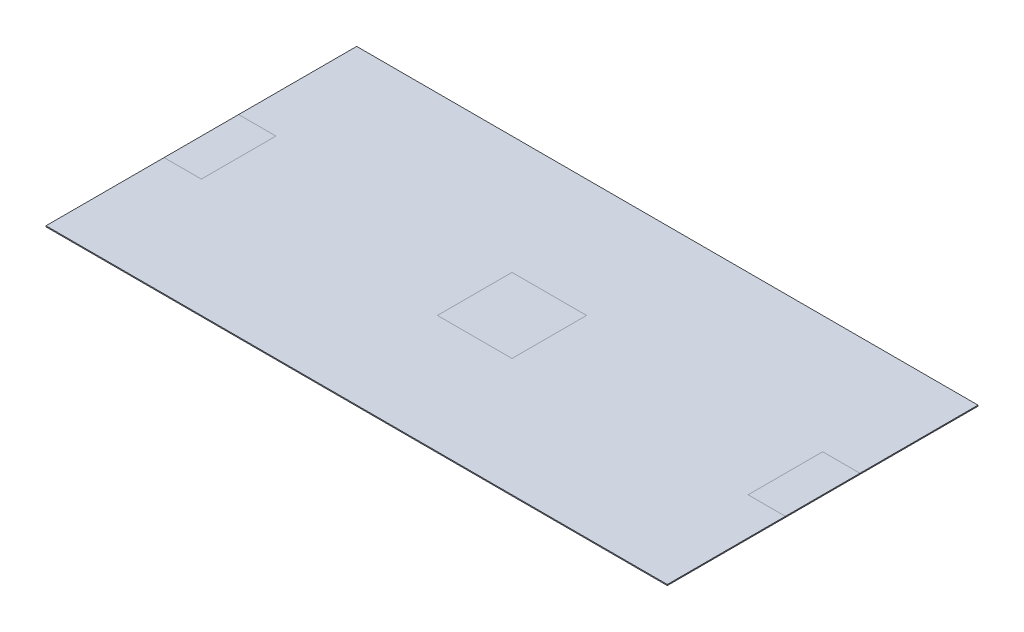
ISO-10303-21;
HEADER;
FILE_DESCRIPTION(('STEP AP214'),'2;1');
FILE_NAME('part.step','',(''),(''),'','','');
FILE_SCHEMA(('AUTOMOTIVE_DESIGN { 1 0 10303 214 1 1 1 1 }'));
ENDSEC;
DATA;
#1=APPLICATION_CONTEXT('core data for automotive mechanical design processes');
#2=APPLICATION_PROTOCOL_DEFINITION('international standard','automotive_design',2000,#1);
#3=PRODUCT_CONTEXT('',#1,'mechanical');
#4=PRODUCT('Part','Part','',(#3));
#5=PRODUCT_RELATED_PRODUCT_CATEGORY('part','',(#4));
#6=PRODUCT_DEFINITION_FORMATION('','',#4);
#7=PRODUCT_DEFINITION_CONTEXT('part definition',#1,'design');
#8=PRODUCT_DEFINITION('design','',#6,#7);
#9=PRODUCT_DEFINITION_SHAPE('','',#8);
#10=(LENGTH_UNIT() NAMED_UNIT(*) SI_UNIT(.MILLI.,.METRE.));
#11=(NAMED_UNIT(*) PLANE_ANGLE_UNIT() SI_UNIT($,.RADIAN.));
#12=(NAMED_UNIT(*) SI_UNIT($,.STERADIAN.) SOLID_ANGLE_UNIT());
#13=UNCERTAINTY_MEASURE_WITH_UNIT(LENGTH_MEASURE(1.E-05),#10,'distance_accuracy_value','');
#14=(GEOMETRIC_REPRESENTATION_CONTEXT(3) GLOBAL_UNCERTAINTY_ASSIGNED_CONTEXT((#13)) GLOBAL_UNIT_ASSIGNED_CONTEXT((#10,
#11,#12)) REPRESENTATION_CONTEXT('',''));
#15=CARTESIAN_POINT('',(0.,0.,0.));
#16=DIRECTION('',(0.,0.,1.));
#17=DIRECTION('',(1.,0.,0.));
#18=AXIS2_PLACEMENT_3D('',#15,#16,#17);
#19=CARTESIAN_POINT('',(-150.,-0.00999999999999959,150.));
#20=DIRECTION('',(0.,0.,1.));
#21=DIRECTION('',(1.,0.,0.));
#22=AXIS2_PLACEMENT_3D('',#19,#20,#21);
#23=PLANE('',#22);
#24=DIRECTION('',(-1.,0.,0.));
#25=VECTOR('',#24,1.);
#26=CARTESIAN_POINT('',(0.,0.,150.));
#27=LINE('',#26,#25);
#28=CARTESIAN_POINT('',(150.,0.,150.));
#29=VERTEX_POINT('',#28);
#30=CARTESIAN_POINT('',(-150.,0.,150.));
#31=VERTEX_POINT('',#30);
#32=EDGE_CURVE('E96',#29,#31,#27,.T.);
#33=ORIENTED_EDGE('',*,*,#32,.F.);
#34=DIRECTION('',(0.,1.,0.));
#35=VECTOR('',#34,1.);
#36=CARTESIAN_POINT('',(150.,-0.00999999999999959,150.));
#37=LINE('',#36,#35);
#38=CARTESIAN_POINT('',(150.,4.,150.));
#39=VERTEX_POINT('',#38);
#40=EDGE_CURVE('E56',#29,#39,#37,.T.);
#41=ORIENTED_EDGE('',*,*,#40,.T.);
#42=DIRECTION('',(-1.,0.,0.));
#43=VECTOR('',#42,1.);
#44=CARTESIAN_POINT('',(0.,4.,150.));
#45=LINE('',#44,#43);
#46=CARTESIAN_POINT('',(-150.,4.,150.));
#47=VERTEX_POINT('',#46);
#48=EDGE_CURVE('E51',#39,#47,#45,.T.);
#49=ORIENTED_EDGE('',*,*,#48,.T.);
#50=DIRECTION('',(0.,1.,0.));
#51=VECTOR('',#50,1.);
#52=CARTESIAN_POINT('',(-150.,-0.00999999999999959,150.));
#53=LINE('',#52,#51);
#54=EDGE_CURVE('E12',#31,#47,#53,.T.);
#55=ORIENTED_EDGE('',*,*,#54,.F.);
#56=EDGE_LOOP('',(#33,#41,#49,#55));
#57=FACE_BOUND('',#56,.T.);
#58=ADVANCED_FACE('F47',(#57),#23,.T.);
#59=CARTESIAN_POINT('',(150.,-0.00999999999999959,150.));
#60=DIRECTION('',(1.,0.,0.));
#61=DIRECTION('',(0.,0.,-1.));
#62=AXIS2_PLACEMENT_3D('',#59,#60,#61);
#63=PLANE('',#62);
#64=DIRECTION('',(0.,0.,1.));
#65=VECTOR('',#64,1.);
#66=CARTESIAN_POINT('',(150.,0.,0.));
#67=LINE('',#66,#65);
#68=CARTESIAN_POINT('',(150.,0.,-150.));
#69=VERTEX_POINT('',#68);
#70=EDGE_CURVE('E91',#69,#29,#67,.T.);
#71=ORIENTED_EDGE('',*,*,#70,.F.);
#72=DIRECTION('',(0.,1.,0.));
#73=VECTOR('',#72,1.);
#74=CARTESIAN_POINT('',(150.,-0.00999999999999959,-150.));
#75=LINE('',#74,#73);
#76=CARTESIAN_POINT('',(150.,4.,-150.));
#77=VERTEX_POINT('',#76);
#78=EDGE_CURVE('E85',#69,#77,#75,.T.);
#79=ORIENTED_EDGE('',*,*,#78,.T.);
#80=DIRECTION('',(0.,0.,1.));
#81=VECTOR('',#80,1.);
#82=CARTESIAN_POINT('',(150.,4.,0.));
#83=LINE('',#82,#81);
#84=EDGE_CURVE('E89',#77,#39,#83,.T.);
#85=ORIENTED_EDGE('',*,*,#84,.T.);
#86=ORIENTED_EDGE('',*,*,#40,.F.);
#87=EDGE_LOOP('',(#71,#79,#85,#86));
#88=FACE_BOUND('',#87,.T.);
#89=ADVANCED_FACE('F87',(#88),#63,.T.);
#90=CARTESIAN_POINT('',(-150.,-0.00999999999999959,150.));
#91=DIRECTION('',(-1.,0.,0.));
#92=DIRECTION('',(0.,0.,1.));
#93=AXIS2_PLACEMENT_3D('',#90,#91,#92);
#94=PLANE('',#93);
#95=DIRECTION('',(0.,0.,-1.));
#96=VECTOR('',#95,1.);
#97=CARTESIAN_POINT('',(-150.,0.,0.));
#98=LINE('',#97,#96);
#99=CARTESIAN_POINT('',(-150.,0.,-150.));
#100=VERTEX_POINT('',#99);
#101=EDGE_CURVE('E116',#31,#100,#98,.T.);
#102=ORIENTED_EDGE('',*,*,#101,.F.);
#103=ORIENTED_EDGE('',*,*,#54,.T.);
#104=DIRECTION('',(0.,0.,-1.));
#105=VECTOR('',#104,1.);
#106=CARTESIAN_POINT('',(-150.,4.,0.));
#107=LINE('',#106,#105);
#108=CARTESIAN_POINT('',(-150.,4.,-150.));
#109=VERTEX_POINT('',#108);
#110=EDGE_CURVE('E104',#47,#109,#107,.T.);
#111=ORIENTED_EDGE('',*,*,#110,.T.);
#112=DIRECTION('',(0.,1.,0.));
#113=VECTOR('',#112,1.);
#114=CARTESIAN_POINT('',(-150.,-0.00999999999999959,-150.));
#115=LINE('',#114,#113);
#116=EDGE_CURVE('E95',#100,#109,#115,.T.);
#117=ORIENTED_EDGE('',*,*,#116,.F.);
#118=EDGE_LOOP('',(#102,#103,#111,#117));
#119=FACE_BOUND('',#118,.T.);
#120=ADVANCED_FACE('F121',(#119),#94,.T.);
#121=CARTESIAN_POINT('',(-150.,-0.00999999999999959,-150.));
#122=DIRECTION('',(0.,0.,-1.));
#123=DIRECTION('',(-1.,0.,0.));
#124=AXIS2_PLACEMENT_3D('',#121,#122,#123);
#125=PLANE('',#124);
#126=DIRECTION('',(1.,0.,0.));
#127=VECTOR('',#126,1.);
#128=CARTESIAN_POINT('',(0.,0.,-150.));
#129=LINE('',#128,#127);
#130=EDGE_CURVE('E108',#100,#69,#129,.T.);
#131=ORIENTED_EDGE('',*,*,#130,.F.);
#132=ORIENTED_EDGE('',*,*,#116,.T.);
#133=DIRECTION('',(1.,0.,0.));
#134=VECTOR('',#133,1.);
#135=CARTESIAN_POINT('',(0.,4.,-150.));
#136=LINE('',#135,#134);
#137=EDGE_CURVE('E99',#109,#77,#136,.T.);
#138=ORIENTED_EDGE('',*,*,#137,.T.);
#139=ORIENTED_EDGE('',*,*,#78,.F.);
#140=EDGE_LOOP('',(#131,#132,#138,#139));
#141=FACE_BOUND('',#140,.T.);
#142=ADVANCED_FACE('F100',(#141),#125,.T.);
#143=CARTESIAN_POINT('',(0.,0.,0.));
#144=DIRECTION('',(0.,-1.,0.));
#145=DIRECTION('',(0.,0.,-1.));
#146=AXIS2_PLACEMENT_3D('',#143,#144,#145);
#147=PLANE('',#146);
#148=ORIENTED_EDGE('',*,*,#130,.T.);
#149=ORIENTED_EDGE('',*,*,#70,.T.);
#150=ORIENTED_EDGE('',*,*,#32,.T.);
#151=ORIENTED_EDGE('',*,*,#101,.T.);
#152=EDGE_LOOP('',(#148,#149,#150,#151));
#153=FACE_BOUND('',#152,.T.);
#154=ADVANCED_FACE('F119',(#153),#147,.T.);
#155=CARTESIAN_POINT('',(0.,4.,0.));
#156=DIRECTION('',(0.,-1.,0.));
#157=DIRECTION('',(0.,0.,-1.));
#158=AXIS2_PLACEMENT_3D('',#155,#156,#157);
#159=PLANE('',#158);
#160=ORIENTED_EDGE('',*,*,#84,.F.);
#161=ORIENTED_EDGE('',*,*,#137,.F.);
#162=ORIENTED_EDGE('',*,*,#110,.F.);
#163=ORIENTED_EDGE('',*,*,#48,.F.);
#164=EDGE_LOOP('',(#160,#161,#162,#163));
#165=FACE_BOUND('',#164,.T.);
#166=ADVANCED_FACE('F49',(#165),#159,.F.);
#167=CLOSED_SHELL('',(#58,#89,#120,#142,#154,#166));
#168=MANIFOLD_SOLID_BREP('B2',#167);
#169=CARTESIAN_POINT('',(-1100.,-0.00999999999999959,-150.));
#170=DIRECTION('',(0.,0.,-1.));
#171=DIRECTION('',(-1.,0.,0.));
#172=AXIS2_PLACEMENT_3D('',#169,#170,#171);
#173=PLANE('',#172);
#174=DIRECTION('',(1.,0.,0.));
#175=VECTOR('',#174,1.);
#176=CARTESIAN_POINT('',(0.,0.,-150.));
#177=LINE('',#176,#175);
#178=CARTESIAN_POINT('',(-1250.,0.,-150.));
#179=VERTEX_POINT('',#178);
#180=CARTESIAN_POINT('',(-1100.,0.,-150.));
#181=VERTEX_POINT('',#180);
#182=EDGE_CURVE('E232',#179,#181,#177,.T.);
#183=ORIENTED_EDGE('',*,*,#182,.F.);
#184=DIRECTION('',(0.,1.,0.));
#185=VECTOR('',#184,1.);
#186=CARTESIAN_POINT('',(-1250.,-0.00999999999999959,-150.));
#187=LINE('',#186,#185);
#188=CARTESIAN_POINT('',(-1250.,4.,-150.));
#189=VERTEX_POINT('',#188);
#190=EDGE_CURVE('E224',#179,#189,#187,.T.);
#191=ORIENTED_EDGE('',*,*,#190,.T.);
#192=DIRECTION('',(1.,0.,0.));
#193=VECTOR('',#192,1.);
#194=CARTESIAN_POINT('',(0.,4.,-150.));
#195=LINE('',#194,#193);
#196=CARTESIAN_POINT('',(-1100.,4.,-150.));
#197=VERTEX_POINT('',#196);
#198=EDGE_CURVE('E235',#189,#197,#195,.T.);
#199=ORIENTED_EDGE('',*,*,#198,.T.);
#200=DIRECTION('',(0.,1.,0.));
#201=VECTOR('',#200,1.);
#202=CARTESIAN_POINT('',(-1100.,-0.00999999999999959,-150.));
#203=LINE('',#202,#201);
#204=EDGE_CURVE('E45',#181,#197,#203,.T.);
#205=ORIENTED_EDGE('',*,*,#204,.F.);
#206=EDGE_LOOP('',(#183,#191,#199,#205));
#207=FACE_BOUND('',#206,.T.);
#208=ADVANCED_FACE('F181',(#207),#173,.T.);
#209=CARTESIAN_POINT('',(-1100.,-0.00999999999999959,150.));
#210=DIRECTION('',(1.,0.,0.));
#211=DIRECTION('',(0.,0.,-1.));
#212=AXIS2_PLACEMENT_3D('',#209,#210,#211);
#213=PLANE('',#212);
#214=DIRECTION('',(0.,0.,1.));
#215=VECTOR('',#214,1.);
#216=CARTESIAN_POINT('',(-1100.,0.,0.));
#217=LINE('',#216,#215);
#218=CARTESIAN_POINT('',(-1100.,0.,150.));
#219=VERTEX_POINT('',#218);
#220=EDGE_CURVE('E250',#181,#219,#217,.T.);
#221=ORIENTED_EDGE('',*,*,#220,.F.);
#222=ORIENTED_EDGE('',*,*,#204,.T.);
#223=DIRECTION('',(0.,0.,1.));
#224=VECTOR('',#223,1.);
#225=CARTESIAN_POINT('',(-1100.,4.,0.));
#226=LINE('',#225,#224);
#227=CARTESIAN_POINT('',(-1100.,4.,150.));
#228=VERTEX_POINT('',#227);
#229=EDGE_CURVE('E241',#197,#228,#226,.T.);
#230=ORIENTED_EDGE('',*,*,#229,.T.);
#231=DIRECTION('',(0.,1.,0.));
#232=VECTOR('',#231,1.);
#233=CARTESIAN_POINT('',(-1100.,-0.00999999999999959,150.));
#234=LINE('',#233,#232);
#235=EDGE_CURVE('E189',#219,#228,#234,.T.);
#236=ORIENTED_EDGE('',*,*,#235,.F.);
#237=EDGE_LOOP('',(#221,#222,#230,#236));
#238=FACE_BOUND('',#237,.T.);
#239=ADVANCED_FACE('F256',(#238),#213,.T.);
#240=CARTESIAN_POINT('',(-1250.,-0.00999999999999959,150.));
#241=DIRECTION('',(0.,0.,1.));
#242=DIRECTION('',(1.,0.,0.));
#243=AXIS2_PLACEMENT_3D('',#240,#241,#242);
#244=PLANE('',#243);
#245=DIRECTION('',(-1.,0.,0.));
#246=VECTOR('',#245,1.);
#247=CARTESIAN_POINT('',(0.,0.,150.));
#248=LINE('',#247,#246);
#249=CARTESIAN_POINT('',(-1250.,0.,150.));
#250=VERTEX_POINT('',#249);
#251=EDGE_CURVE('E248',#219,#250,#248,.T.);
#252=ORIENTED_EDGE('',*,*,#251,.F.);
#253=ORIENTED_EDGE('',*,*,#235,.T.);
#254=DIRECTION('',(-1.,0.,0.));
#255=VECTOR('',#254,1.);
#256=CARTESIAN_POINT('',(0.,4.,150.));
#257=LINE('',#256,#255);
#258=CARTESIAN_POINT('',(-1250.,4.,150.));
#259=VERTEX_POINT('',#258);
#260=EDGE_CURVE('E238',#228,#259,#257,.T.);
#261=ORIENTED_EDGE('',*,*,#260,.T.);
#262=DIRECTION('',(0.,1.,0.));
#263=VECTOR('',#262,1.);
#264=CARTESIAN_POINT('',(-1250.,-0.00999999999999959,150.));
#265=LINE('',#264,#263);
#266=EDGE_CURVE('E227',#250,#259,#265,.T.);
#267=ORIENTED_EDGE('',*,*,#266,.F.);
#268=EDGE_LOOP('',(#252,#253,#261,#267));
#269=FACE_BOUND('',#268,.T.);
#270=ADVANCED_FACE('F254',(#269),#244,.T.);
#271=CARTESIAN_POINT('',(-1250.,4.,625.));
#272=DIRECTION('',(1.,0.,0.));
#273=DIRECTION('',(0.,0.,-1.));
#274=AXIS2_PLACEMENT_3D('',#271,#272,#273);
#275=PLANE('',#274);
#276=DIRECTION('',(0.,0.,1.));
#277=VECTOR('',#276,1.);
#278=CARTESIAN_POINT('',(-1250.,0.,625.));
#279=LINE('',#278,#277);
#280=EDGE_CURVE('E231',#179,#250,#279,.T.);
#281=ORIENTED_EDGE('',*,*,#280,.T.);
#282=ORIENTED_EDGE('',*,*,#266,.T.);
#283=DIRECTION('',(0.,0.,1.));
#284=VECTOR('',#283,1.);
#285=CARTESIAN_POINT('',(-1250.,4.,625.));
#286=LINE('',#285,#284);
#287=EDGE_CURVE('E220',#189,#259,#286,.T.);
#288=ORIENTED_EDGE('',*,*,#287,.F.);
#289=ORIENTED_EDGE('',*,*,#190,.F.);
#290=EDGE_LOOP('',(#281,#282,#288,#289));
#291=FACE_BOUND('',#290,.T.);
#292=ADVANCED_FACE('F223',(#291),#275,.F.);
#293=CARTESIAN_POINT('',(0.,4.,0.));
#294=DIRECTION('',(0.,-1.,0.));
#295=DIRECTION('',(0.,0.,-1.));
#296=AXIS2_PLACEMENT_3D('',#293,#294,#295);
#297=PLANE('',#296);
#298=ORIENTED_EDGE('',*,*,#260,.F.);
#299=ORIENTED_EDGE('',*,*,#229,.F.);
#300=ORIENTED_EDGE('',*,*,#198,.F.);
#301=ORIENTED_EDGE('',*,*,#287,.T.);
#302=EDGE_LOOP('',(#298,#299,#300,#301));
#303=FACE_BOUND('',#302,.T.);
#304=ADVANCED_FACE('F240',(#303),#297,.F.);
#305=CARTESIAN_POINT('',(0.,0.,0.));
#306=DIRECTION('',(0.,-1.,0.));
#307=DIRECTION('',(0.,0.,-1.));
#308=AXIS2_PLACEMENT_3D('',#305,#306,#307);
#309=PLANE('',#308);
#310=ORIENTED_EDGE('',*,*,#220,.T.);
#311=ORIENTED_EDGE('',*,*,#251,.T.);
#312=ORIENTED_EDGE('',*,*,#280,.F.);
#313=ORIENTED_EDGE('',*,*,#182,.T.);
#314=EDGE_LOOP('',(#310,#311,#312,#313));
#315=FACE_BOUND('',#314,.T.);
#316=ADVANCED_FACE('F183',(#315),#309,.T.);
#317=CLOSED_SHELL('',(#208,#239,#270,#292,#304,#316));
#318=MANIFOLD_SOLID_BREP('B6',#317);
#319=CARTESIAN_POINT('',(-1100.,-0.00999999999999959,-150.));
#320=DIRECTION('',(0.,0.,-1.));
#321=DIRECTION('',(-1.,0.,0.));
#322=AXIS2_PLACEMENT_3D('',#319,#320,#321);
#323=PLANE('',#322);
#324=DIRECTION('',(1.,0.,0.));
#325=VECTOR('',#324,1.);
#326=CARTESIAN_POINT('',(0.,0.,-150.));
#327=LINE('',#326,#325);
#328=CARTESIAN_POINT('',(-1250.,0.,-150.));
#329=VERTEX_POINT('',#328);
#330=CARTESIAN_POINT('',(-1100.,0.,-150.));
#331=VERTEX_POINT('',#330);
#332=EDGE_CURVE('E474',#329,#331,#327,.T.);
#333=ORIENTED_EDGE('',*,*,#332,.T.);
#334=DIRECTION('',(0.,1.,0.));
#335=VECTOR('',#334,1.);
#336=CARTESIAN_POINT('',(-1100.,-0.00999999999999959,-150.));
#337=LINE('',#336,#335);
#338=CARTESIAN_POINT('',(-1100.,4.,-150.));
#339=VERTEX_POINT('',#338);
#340=EDGE_CURVE('E318',#331,#339,#337,.T.);
#341=ORIENTED_EDGE('',*,*,#340,.T.);
#342=DIRECTION('',(1.,0.,0.));
#343=VECTOR('',#342,1.);
#344=CARTESIAN_POINT('',(0.,4.,-150.));
#345=LINE('',#344,#343);
#346=CARTESIAN_POINT('',(-1250.,4.,-150.));
#347=VERTEX_POINT('',#346);
#348=EDGE_CURVE('E461',#347,#339,#345,.T.);
#349=ORIENTED_EDGE('',*,*,#348,.F.);
#350=DIRECTION('',(0.,1.,0.));
#351=VECTOR('',#350,1.);
#352=CARTESIAN_POINT('',(-1250.,-0.00999999999999959,-150.));
#353=LINE('',#352,#351);
#354=EDGE_CURVE('E470',#329,#347,#353,.T.);
#355=ORIENTED_EDGE('',*,*,#354,.F.);
#356=EDGE_LOOP('',(#333,#341,#349,#355));
#357=FACE_BOUND('',#356,.T.);
#358=ADVANCED_FACE('F314',(#357),#323,.F.);
#359=CARTESIAN_POINT('',(-1100.,-0.00999999999999959,150.));
#360=DIRECTION('',(1.,0.,0.));
#361=DIRECTION('',(0.,0.,-1.));
#362=AXIS2_PLACEMENT_3D('',#359,#360,#361);
#363=PLANE('',#362);
#364=DIRECTION('',(0.,0.,1.));
#365=VECTOR('',#364,1.);
#366=CARTESIAN_POINT('',(-1100.,0.,0.));
#367=LINE('',#366,#365);
#368=CARTESIAN_POINT('',(-1100.,0.,150.));
#369=VERTEX_POINT('',#368);
#370=EDGE_CURVE('E489',#331,#369,#367,.T.);
#371=ORIENTED_EDGE('',*,*,#370,.T.);
#372=DIRECTION('',(0.,1.,0.));
#373=VECTOR('',#372,1.);
#374=CARTESIAN_POINT('',(-1100.,-0.00999999999999959,150.));
#375=LINE('',#374,#373);
#376=CARTESIAN_POINT('',(-1100.,4.,150.));
#377=VERTEX_POINT('',#376);
#378=EDGE_CURVE('E478',#369,#377,#375,.T.);
#379=ORIENTED_EDGE('',*,*,#378,.T.);
#380=DIRECTION('',(0.,0.,1.));
#381=VECTOR('',#380,1.);
#382=CARTESIAN_POINT('',(-1100.,4.,0.));
#383=LINE('',#382,#381);
#384=EDGE_CURVE('E502',#339,#377,#383,.T.);
#385=ORIENTED_EDGE('',*,*,#384,.F.);
#386=ORIENTED_EDGE('',*,*,#340,.F.);
#387=EDGE_LOOP('',(#371,#379,#385,#386));
#388=FACE_BOUND('',#387,.T.);
#389=ADVANCED_FACE('F503',(#388),#363,.F.);
#390=CARTESIAN_POINT('',(-1250.,-0.00999999999999959,150.));
#391=DIRECTION('',(0.,0.,1.));
#392=DIRECTION('',(1.,0.,0.));
#393=AXIS2_PLACEMENT_3D('',#390,#391,#392);
#394=PLANE('',#393);
#395=DIRECTION('',(-1.,0.,0.));
#396=VECTOR('',#395,1.);
#397=CARTESIAN_POINT('',(0.,0.,150.));
#398=LINE('',#397,#396);
#399=CARTESIAN_POINT('',(-1250.,0.,150.));
#400=VERTEX_POINT('',#399);
#401=EDGE_CURVE('E486',#369,#400,#398,.T.);
#402=ORIENTED_EDGE('',*,*,#401,.T.);
#403=DIRECTION('',(0.,1.,0.));
#404=VECTOR('',#403,1.);
#405=CARTESIAN_POINT('',(-1250.,-0.00999999999999959,150.));
#406=LINE('',#405,#404);
#407=CARTESIAN_POINT('',(-1250.,4.,150.));
#408=VERTEX_POINT('',#407);
#409=EDGE_CURVE('E483',#400,#408,#406,.T.);
#410=ORIENTED_EDGE('',*,*,#409,.T.);
#411=DIRECTION('',(-1.,0.,0.));
#412=VECTOR('',#411,1.);
#413=CARTESIAN_POINT('',(0.,4.,150.));
#414=LINE('',#413,#412);
#415=EDGE_CURVE('E467',#377,#408,#414,.T.);
#416=ORIENTED_EDGE('',*,*,#415,.F.);
#417=ORIENTED_EDGE('',*,*,#378,.F.);
#418=EDGE_LOOP('',(#402,#410,#416,#417));
#419=FACE_BOUND('',#418,.T.);
#420=ADVANCED_FACE('F583',(#419),#394,.F.);
#421=CARTESIAN_POINT('',(1100.,-0.00999999999999959,150.));
#422=DIRECTION('',(0.,0.,1.));
#423=DIRECTION('',(1.,0.,0.));
#424=AXIS2_PLACEMENT_3D('',#421,#422,#423);
#425=PLANE('',#424);
#426=DIRECTION('',(-1.,0.,0.));
#427=VECTOR('',#426,1.);
#428=CARTESIAN_POINT('',(0.,0.,150.));
#429=LINE('',#428,#427);
#430=CARTESIAN_POINT('',(1250.,0.,150.));
#431=VERTEX_POINT('',#430);
#432=CARTESIAN_POINT('',(1100.,0.,150.));
#433=VERTEX_POINT('',#432);
#434=EDGE_CURVE('E451',#431,#433,#429,.T.);
#435=ORIENTED_EDGE('',*,*,#434,.T.);
#436=DIRECTION('',(0.,1.,0.));
#437=VECTOR('',#436,1.);
#438=CARTESIAN_POINT('',(1100.,-0.00999999999999959,150.));
#439=LINE('',#438,#437);
#440=CARTESIAN_POINT('',(1100.,4.,150.));
#441=VERTEX_POINT('',#440);
#442=EDGE_CURVE('E448',#433,#441,#439,.T.);
#443=ORIENTED_EDGE('',*,*,#442,.T.);
#444=DIRECTION('',(-1.,0.,0.));
#445=VECTOR('',#444,1.);
#446=CARTESIAN_POINT('',(0.,4.,150.));
#447=LINE('',#446,#445);
#448=CARTESIAN_POINT('',(1250.,4.,150.));
#449=VERTEX_POINT('',#448);
#450=EDGE_CURVE('E436',#449,#441,#447,.T.);
#451=ORIENTED_EDGE('',*,*,#450,.F.);
#452=DIRECTION('',(0.,1.,0.));
#453=VECTOR('',#452,1.);
#454=CARTESIAN_POINT('',(1250.,4.,150.));
#455=LINE('',#454,#453);
#456=EDGE_CURVE('E465',#431,#449,#455,.T.);
#457=ORIENTED_EDGE('',*,*,#456,.F.);
#458=EDGE_LOOP('',(#435,#443,#451,#457));
#459=FACE_BOUND('',#458,.T.);
#460=ADVANCED_FACE('F449',(#459),#425,.F.);
#461=CARTESIAN_POINT('',(1100.,-0.00999999999999959,-150.));
#462=DIRECTION('',(-1.,0.,0.));
#463=DIRECTION('',(0.,0.,1.));
#464=AXIS2_PLACEMENT_3D('',#461,#462,#463);
#465=PLANE('',#464);
#466=DIRECTION('',(0.,0.,-1.));
#467=VECTOR('',#466,1.);
#468=CARTESIAN_POINT('',(1100.,0.,0.));
#469=LINE('',#468,#467);
#470=CARTESIAN_POINT('',(1100.,0.,-150.));
#471=VERTEX_POINT('',#470);
#472=EDGE_CURVE('E475',#433,#471,#469,.T.);
#473=ORIENTED_EDGE('',*,*,#472,.T.);
#474=DIRECTION('',(0.,1.,0.));
#475=VECTOR('',#474,1.);
#476=CARTESIAN_POINT('',(1100.,-0.00999999999999959,-150.));
#477=LINE('',#476,#475);
#478=CARTESIAN_POINT('',(1100.,4.,-150.));
#479=VERTEX_POINT('',#478);
#480=EDGE_CURVE('E454',#471,#479,#477,.T.);
#481=ORIENTED_EDGE('',*,*,#480,.T.);
#482=DIRECTION('',(0.,0.,-1.));
#483=VECTOR('',#482,1.);
#484=CARTESIAN_POINT('',(1100.,4.,0.));
#485=LINE('',#484,#483);
#486=EDGE_CURVE('E440',#441,#479,#485,.T.);
#487=ORIENTED_EDGE('',*,*,#486,.F.);
#488=ORIENTED_EDGE('',*,*,#442,.F.);
#489=EDGE_LOOP('',(#473,#481,#487,#488));
#490=FACE_BOUND('',#489,.T.);
#491=ADVANCED_FACE('F456',(#490),#465,.F.);
#492=CARTESIAN_POINT('',(1250.,-0.00999999999999959,-150.));
#493=DIRECTION('',(0.,0.,-1.));
#494=DIRECTION('',(-1.,0.,0.));
#495=AXIS2_PLACEMENT_3D('',#492,#493,#494);
#496=PLANE('',#495);
#497=DIRECTION('',(1.,0.,0.));
#498=VECTOR('',#497,1.);
#499=CARTESIAN_POINT('',(0.,0.,-150.));
#500=LINE('',#499,#498);
#501=CARTESIAN_POINT('',(1250.,0.,-150.));
#502=VERTEX_POINT('',#501);
#503=EDGE_CURVE('E471',#471,#502,#500,.T.);
#504=ORIENTED_EDGE('',*,*,#503,.T.);
#505=DIRECTION('',(0.,-1.,0.));
#506=VECTOR('',#505,1.);
#507=CARTESIAN_POINT('',(1250.,4.,-150.));
#508=LINE('',#507,#506);
#509=CARTESIAN_POINT('',(1250.,4.,-150.));
#510=VERTEX_POINT('',#509);
#511=EDGE_CURVE('E468',#510,#502,#508,.T.);
#512=ORIENTED_EDGE('',*,*,#511,.F.);
#513=DIRECTION('',(1.,0.,0.));
#514=VECTOR('',#513,1.);
#515=CARTESIAN_POINT('',(0.,4.,-150.));
#516=LINE('',#515,#514);
#517=EDGE_CURVE('E459',#479,#510,#516,.T.);
#518=ORIENTED_EDGE('',*,*,#517,.F.);
#519=ORIENTED_EDGE('',*,*,#480,.F.);
#520=EDGE_LOOP('',(#504,#512,#518,#519));
#521=FACE_BOUND('',#520,.T.);
#522=ADVANCED_FACE('F573',(#521),#496,.F.);
#523=CARTESIAN_POINT('',(-1250.,4.,625.));
#524=DIRECTION('',(1.,0.,0.));
#525=DIRECTION('',(0.,0.,-1.));
#526=AXIS2_PLACEMENT_3D('',#523,#524,#525);
#527=PLANE('',#526);
#528=DIRECTION('',(0.,0.,1.));
#529=VECTOR('',#528,1.);
#530=CARTESIAN_POINT('',(-1250.,0.,625.));
#531=LINE('',#530,#529);
#532=CARTESIAN_POINT('',(-1250.,0.,-625.));
#533=VERTEX_POINT('',#532);
#534=EDGE_CURVE('E550',#533,#329,#531,.T.);
#535=ORIENTED_EDGE('',*,*,#534,.T.);
#536=ORIENTED_EDGE('',*,*,#354,.T.);
#537=DIRECTION('',(0.,0.,1.));
#538=VECTOR('',#537,1.);
#539=CARTESIAN_POINT('',(-1250.,4.,625.));
#540=LINE('',#539,#538);
#541=CARTESIAN_POINT('',(-1250.,4.,-625.));
#542=VERTEX_POINT('',#541);
#543=EDGE_CURVE('E556',#542,#347,#540,.T.);
#544=ORIENTED_EDGE('',*,*,#543,.F.);
#545=DIRECTION('',(0.,-1.,0.));
#546=VECTOR('',#545,1.);
#547=CARTESIAN_POINT('',(-1250.,4.,-625.));
#548=LINE('',#547,#546);
#549=EDGE_CURVE('E541',#542,#533,#548,.T.);
#550=ORIENTED_EDGE('',*,*,#549,.T.);
#551=EDGE_LOOP('',(#535,#536,#544,#550));
#552=FACE_BOUND('',#551,.T.);
#553=ADVANCED_FACE('F581',(#552),#527,.F.);
#554=CARTESIAN_POINT('',(-1250.,4.,-625.));
#555=DIRECTION('',(0.,0.,1.));
#556=DIRECTION('',(1.,0.,0.));
#557=AXIS2_PLACEMENT_3D('',#554,#555,#556);
#558=PLANE('',#557);
#559=DIRECTION('',(-1.,0.,0.));
#560=VECTOR('',#559,1.);
#561=CARTESIAN_POINT('',(-1250.,0.,-625.));
#562=LINE('',#561,#560);
#563=CARTESIAN_POINT('',(1250.,0.,-625.));
#564=VERTEX_POINT('',#563);
#565=EDGE_CURVE('E481',#564,#533,#562,.T.);
#566=ORIENTED_EDGE('',*,*,#565,.T.);
#567=ORIENTED_EDGE('',*,*,#549,.F.);
#568=DIRECTION('',(-1.,0.,0.));
#569=VECTOR('',#568,1.);
#570=CARTESIAN_POINT('',(-1250.,4.,-625.));
#571=LINE('',#570,#569);
#572=CARTESIAN_POINT('',(1250.,4.,-625.));
#573=VERTEX_POINT('',#572);
#574=EDGE_CURVE('E350',#573,#542,#571,.T.);
#575=ORIENTED_EDGE('',*,*,#574,.F.);
#576=DIRECTION('',(0.,-1.,0.));
#577=VECTOR('',#576,1.);
#578=CARTESIAN_POINT('',(1250.,4.,-625.));
#579=LINE('',#578,#577);
#580=EDGE_CURVE('E531',#573,#564,#579,.T.);
#581=ORIENTED_EDGE('',*,*,#580,.T.);
#582=EDGE_LOOP('',(#566,#567,#575,#581));
#583=FACE_BOUND('',#582,.T.);
#584=ADVANCED_FACE('F577',(#583),#558,.F.);
#585=CARTESIAN_POINT('',(1250.,4.,625.));
#586=DIRECTION('',(-1.,0.,0.));
#587=DIRECTION('',(0.,0.,1.));
#588=AXIS2_PLACEMENT_3D('',#585,#586,#587);
#589=PLANE('',#588);
#590=DIRECTION('',(0.,0.,-1.));
#591=VECTOR('',#590,1.);
#592=CARTESIAN_POINT('',(1250.,4.,625.));
#593=LINE('',#592,#591);
#594=EDGE_CURVE('E355',#510,#573,#593,.T.);
#595=ORIENTED_EDGE('',*,*,#594,.F.);
#596=ORIENTED_EDGE('',*,*,#511,.T.);
#597=DIRECTION('',(0.,0.,-1.));
#598=VECTOR('',#597,1.);
#599=CARTESIAN_POINT('',(1250.,0.,625.));
#600=LINE('',#599,#598);
#601=EDGE_CURVE('E179',#502,#564,#600,.T.);
#602=ORIENTED_EDGE('',*,*,#601,.T.);
#603=ORIENTED_EDGE('',*,*,#580,.F.);
#604=EDGE_LOOP('',(#595,#596,#602,#603));
#605=FACE_BOUND('',#604,.T.);
#606=ADVANCED_FACE('F575',(#605),#589,.F.);
#607=CARTESIAN_POINT('',(1250.,0.,625.));
#608=VERTEX_POINT('',#607);
#609=EDGE_CURVE('E324',#608,#431,#600,.T.);
#610=ORIENTED_EDGE('',*,*,#609,.T.);
#611=ORIENTED_EDGE('',*,*,#456,.T.);
#612=CARTESIAN_POINT('',(1250.,4.,625.));
#613=VERTEX_POINT('',#612);
#614=EDGE_CURVE('E443',#613,#449,#593,.T.);
#615=ORIENTED_EDGE('',*,*,#614,.F.);
#616=DIRECTION('',(0.,-1.,0.));
#617=VECTOR('',#616,1.);
#618=CARTESIAN_POINT('',(1250.,4.,625.));
#619=LINE('',#618,#617);
#620=EDGE_CURVE('E546',#613,#608,#619,.T.);
#621=ORIENTED_EDGE('',*,*,#620,.T.);
#622=EDGE_LOOP('',(#610,#611,#615,#621));
#623=FACE_BOUND('',#622,.T.);
#624=ADVANCED_FACE('F567',(#623),#589,.F.);
#625=CARTESIAN_POINT('',(-1250.,4.,625.));
#626=DIRECTION('',(0.,0.,-1.));
#627=DIRECTION('',(-1.,0.,0.));
#628=AXIS2_PLACEMENT_3D('',#625,#626,#627);
#629=PLANE('',#628);
#630=DIRECTION('',(1.,0.,0.));
#631=VECTOR('',#630,1.);
#632=CARTESIAN_POINT('',(-1250.,0.,625.));
#633=LINE('',#632,#631);
#634=CARTESIAN_POINT('',(-1250.,0.,625.));
#635=VERTEX_POINT('',#634);
#636=EDGE_CURVE('E362',#635,#608,#633,.T.);
#637=ORIENTED_EDGE('',*,*,#636,.T.);
#638=ORIENTED_EDGE('',*,*,#620,.F.);
#639=DIRECTION('',(1.,0.,0.));
#640=VECTOR('',#639,1.);
#641=CARTESIAN_POINT('',(-1250.,4.,625.));
#642=LINE('',#641,#640);
#643=CARTESIAN_POINT('',(-1250.,4.,625.));
#644=VERTEX_POINT('',#643);
#645=EDGE_CURVE('E548',#644,#613,#642,.T.);
#646=ORIENTED_EDGE('',*,*,#645,.F.);
#647=DIRECTION('',(0.,-1.,0.));
#648=VECTOR('',#647,1.);
#649=CARTESIAN_POINT('',(-1250.,4.,625.));
#650=LINE('',#649,#648);
#651=EDGE_CURVE('E544',#644,#635,#650,.T.);
#652=ORIENTED_EDGE('',*,*,#651,.T.);
#653=EDGE_LOOP('',(#637,#638,#646,#652));
#654=FACE_BOUND('',#653,.T.);
#655=ADVANCED_FACE('F564',(#654),#629,.F.);
#656=ORIENTED_EDGE('',*,*,#409,.F.);
#657=EDGE_CURVE('E553',#400,#635,#531,.T.);
#658=ORIENTED_EDGE('',*,*,#657,.T.);
#659=ORIENTED_EDGE('',*,*,#651,.F.);
#660=EDGE_CURVE('E557',#408,#644,#540,.T.);
#661=ORIENTED_EDGE('',*,*,#660,.F.);
#662=EDGE_LOOP('',(#656,#658,#659,#661));
#663=FACE_BOUND('',#662,.T.);
#664=ADVANCED_FACE('F562',(#663),#527,.F.);
#665=CARTESIAN_POINT('',(-150.,-0.00999999999999959,150.));
#666=DIRECTION('',(-1.,0.,0.));
#667=DIRECTION('',(0.,0.,1.));
#668=AXIS2_PLACEMENT_3D('',#665,#666,#667);
#669=PLANE('',#668);
#670=DIRECTION('',(0.,0.,-1.));
#671=VECTOR('',#670,1.);
#672=CARTESIAN_POINT('',(-150.,0.,0.));
#673=LINE('',#672,#671);
#674=CARTESIAN_POINT('',(-150.,0.,150.));
#675=VERTEX_POINT('',#674);
#676=CARTESIAN_POINT('',(-150.,0.,-150.));
#677=VERTEX_POINT('',#676);
#678=EDGE_CURVE('E536',#675,#677,#673,.T.);
#679=ORIENTED_EDGE('',*,*,#678,.T.);
#680=DIRECTION('',(0.,1.,0.));
#681=VECTOR('',#680,1.);
#682=CARTESIAN_POINT('',(-150.,-0.00999999999999959,-150.));
#683=LINE('',#682,#681);
#684=CARTESIAN_POINT('',(-150.,4.,-150.));
#685=VERTEX_POINT('',#684);
#686=EDGE_CURVE('E509',#677,#685,#683,.T.);
#687=ORIENTED_EDGE('',*,*,#686,.T.);
#688=DIRECTION('',(0.,0.,-1.));
#689=VECTOR('',#688,1.);
#690=CARTESIAN_POINT('',(-150.,4.,0.));
#691=LINE('',#690,#689);
#692=CARTESIAN_POINT('',(-150.,4.,150.));
#693=VERTEX_POINT('',#692);
#694=EDGE_CURVE('E527',#693,#685,#691,.T.);
#695=ORIENTED_EDGE('',*,*,#694,.F.);
#696=DIRECTION('',(0.,1.,0.));
#697=VECTOR('',#696,1.);
#698=CARTESIAN_POINT('',(-150.,-0.00999999999999959,150.));
#699=LINE('',#698,#697);
#700=EDGE_CURVE('E445',#675,#693,#699,.T.);
#701=ORIENTED_EDGE('',*,*,#700,.F.);
#702=EDGE_LOOP('',(#679,#687,#695,#701));
#703=FACE_BOUND('',#702,.T.);
#704=ADVANCED_FACE('F607',(#703),#669,.F.);
#705=CARTESIAN_POINT('',(-150.,-0.00999999999999959,150.));
#706=DIRECTION('',(0.,0.,1.));
#707=DIRECTION('',(1.,0.,0.));
#708=AXIS2_PLACEMENT_3D('',#705,#706,#707);
#709=PLANE('',#708);
#710=DIRECTION('',(-1.,0.,0.));
#711=VECTOR('',#710,1.);
#712=CARTESIAN_POINT('',(0.,0.,150.));
#713=LINE('',#712,#711);
#714=CARTESIAN_POINT('',(150.,0.,150.));
#715=VERTEX_POINT('',#714);
#716=EDGE_CURVE('E516',#715,#675,#713,.T.);
#717=ORIENTED_EDGE('',*,*,#716,.T.);
#718=ORIENTED_EDGE('',*,*,#700,.T.);
#719=DIRECTION('',(-1.,0.,0.));
#720=VECTOR('',#719,1.);
#721=CARTESIAN_POINT('',(0.,4.,150.));
#722=LINE('',#721,#720);
#723=CARTESIAN_POINT('',(150.,4.,150.));
#724=VERTEX_POINT('',#723);
#725=EDGE_CURVE('E529',#724,#693,#722,.T.);
#726=ORIENTED_EDGE('',*,*,#725,.F.);
#727=DIRECTION('',(0.,1.,0.));
#728=VECTOR('',#727,1.);
#729=CARTESIAN_POINT('',(150.,-0.00999999999999959,150.));
#730=LINE('',#729,#728);
#731=EDGE_CURVE('E513',#715,#724,#730,.T.);
#732=ORIENTED_EDGE('',*,*,#731,.F.);
#733=EDGE_LOOP('',(#717,#718,#726,#732));
#734=FACE_BOUND('',#733,.T.);
#735=ADVANCED_FACE('F602',(#734),#709,.F.);
#736=CARTESIAN_POINT('',(150.,-0.00999999999999959,150.));
#737=DIRECTION('',(1.,0.,0.));
#738=DIRECTION('',(0.,0.,-1.));
#739=AXIS2_PLACEMENT_3D('',#736,#737,#738);
#740=PLANE('',#739);
#741=DIRECTION('',(0.,0.,1.));
#742=VECTOR('',#741,1.);
#743=CARTESIAN_POINT('',(150.,0.,0.));
#744=LINE('',#743,#742);
#745=CARTESIAN_POINT('',(150.,0.,-150.));
#746=VERTEX_POINT('',#745);
#747=EDGE_CURVE('E525',#746,#715,#744,.T.);
#748=ORIENTED_EDGE('',*,*,#747,.T.);
#749=ORIENTED_EDGE('',*,*,#731,.T.);
#750=DIRECTION('',(0.,0.,1.));
#751=VECTOR('',#750,1.);
#752=CARTESIAN_POINT('',(150.,4.,0.));
#753=LINE('',#752,#751);
#754=CARTESIAN_POINT('',(150.,4.,-150.));
#755=VERTEX_POINT('',#754);
#756=EDGE_CURVE('E521',#755,#724,#753,.T.);
#757=ORIENTED_EDGE('',*,*,#756,.F.);
#758=DIRECTION('',(0.,1.,0.));
#759=VECTOR('',#758,1.);
#760=CARTESIAN_POINT('',(150.,-0.00999999999999959,-150.));
#761=LINE('',#760,#759);
#762=EDGE_CURVE('E512',#746,#755,#761,.T.);
#763=ORIENTED_EDGE('',*,*,#762,.F.);
#764=EDGE_LOOP('',(#748,#749,#757,#763));
#765=FACE_BOUND('',#764,.T.);
#766=ADVANCED_FACE('F598',(#765),#740,.F.);
#767=CARTESIAN_POINT('',(-150.,-0.00999999999999959,-150.));
#768=DIRECTION('',(0.,0.,-1.));
#769=DIRECTION('',(-1.,0.,0.));
#770=AXIS2_PLACEMENT_3D('',#767,#768,#769);
#771=PLANE('',#770);
#772=DIRECTION('',(1.,0.,0.));
#773=VECTOR('',#772,1.);
#774=CARTESIAN_POINT('',(0.,0.,-150.));
#775=LINE('',#774,#773);
#776=EDGE_CURVE('E534',#677,#746,#775,.T.);
#777=ORIENTED_EDGE('',*,*,#776,.T.);
#778=ORIENTED_EDGE('',*,*,#762,.T.);
#779=DIRECTION('',(1.,0.,0.));
#780=VECTOR('',#779,1.);
#781=CARTESIAN_POINT('',(0.,4.,-150.));
#782=LINE('',#781,#780);
#783=EDGE_CURVE('E524',#685,#755,#782,.T.);
#784=ORIENTED_EDGE('',*,*,#783,.F.);
#785=ORIENTED_EDGE('',*,*,#686,.F.);
#786=EDGE_LOOP('',(#777,#778,#784,#785));
#787=FACE_BOUND('',#786,.T.);
#788=ADVANCED_FACE('F601',(#787),#771,.F.);
#789=CARTESIAN_POINT('',(0.,4.,0.));
#790=DIRECTION('',(0.,-1.,0.));
#791=DIRECTION('',(0.,0.,-1.));
#792=AXIS2_PLACEMENT_3D('',#789,#790,#791);
#793=PLANE('',#792);
#794=ORIENTED_EDGE('',*,*,#783,.T.);
#795=ORIENTED_EDGE('',*,*,#756,.T.);
#796=ORIENTED_EDGE('',*,*,#725,.T.);
#797=ORIENTED_EDGE('',*,*,#694,.T.);
#798=EDGE_LOOP('',(#794,#795,#796,#797));
#799=FACE_BOUND('',#798,.T.);
#800=ORIENTED_EDGE('',*,*,#384,.T.);
#801=ORIENTED_EDGE('',*,*,#415,.T.);
#802=ORIENTED_EDGE('',*,*,#660,.T.);
#803=ORIENTED_EDGE('',*,*,#645,.T.);
#804=ORIENTED_EDGE('',*,*,#614,.T.);
#805=ORIENTED_EDGE('',*,*,#450,.T.);
#806=ORIENTED_EDGE('',*,*,#486,.T.);
#807=ORIENTED_EDGE('',*,*,#517,.T.);
#808=ORIENTED_EDGE('',*,*,#594,.T.);
#809=ORIENTED_EDGE('',*,*,#574,.T.);
#810=ORIENTED_EDGE('',*,*,#543,.T.);
#811=ORIENTED_EDGE('',*,*,#348,.T.);
#812=EDGE_LOOP('',(#800,#801,#802,#803,#804,#805,#806,#807,#808,#809,#810,#811));
#813=FACE_BOUND('',#812,.T.);
#814=ADVANCED_FACE('F438',(#799,#813),#793,.F.);
#815=CARTESIAN_POINT('',(0.,0.,0.));
#816=DIRECTION('',(0.,-1.,0.));
#817=DIRECTION('',(0.,0.,-1.));
#818=AXIS2_PLACEMENT_3D('',#815,#816,#817);
#819=PLANE('',#818);
#820=ORIENTED_EDGE('',*,*,#401,.F.);
#821=ORIENTED_EDGE('',*,*,#370,.F.);
#822=ORIENTED_EDGE('',*,*,#332,.F.);
#823=ORIENTED_EDGE('',*,*,#534,.F.);
#824=ORIENTED_EDGE('',*,*,#565,.F.);
#825=ORIENTED_EDGE('',*,*,#601,.F.);
#826=ORIENTED_EDGE('',*,*,#503,.F.);
#827=ORIENTED_EDGE('',*,*,#472,.F.);
#828=ORIENTED_EDGE('',*,*,#434,.F.);
#829=ORIENTED_EDGE('',*,*,#609,.F.);
#830=ORIENTED_EDGE('',*,*,#636,.F.);
#831=ORIENTED_EDGE('',*,*,#657,.F.);
#832=EDGE_LOOP('',(#820,#821,#822,#823,#824,#825,#826,#827,#828,#829,#830,#831));
#833=FACE_BOUND('',#832,.T.);
#834=ORIENTED_EDGE('',*,*,#747,.F.);
#835=ORIENTED_EDGE('',*,*,#776,.F.);
#836=ORIENTED_EDGE('',*,*,#678,.F.);
#837=ORIENTED_EDGE('',*,*,#716,.F.);
#838=EDGE_LOOP('',(#834,#835,#836,#837));
#839=FACE_BOUND('',#838,.T.);
#840=ADVANCED_FACE('F316',(#833,#839),#819,.T.);
#841=CLOSED_SHELL('',(#358,#389,#420,#460,#491,#522,#553,#584,#606,#624,#655,#664,#704,#735,
#766,#788,#814,#840));
#842=MANIFOLD_SOLID_BREP('B39',#841);
#843=CARTESIAN_POINT('',(1100.,-0.00999999999999959,150.));
#844=DIRECTION('',(0.,0.,1.));
#845=DIRECTION('',(1.,0.,0.));
#846=AXIS2_PLACEMENT_3D('',#843,#844,#845);
#847=PLANE('',#846);
#848=DIRECTION('',(-1.,0.,0.));
#849=VECTOR('',#848,1.);
#850=CARTESIAN_POINT('',(0.,0.,150.));
#851=LINE('',#850,#849);
#852=CARTESIAN_POINT('',(1250.,0.,150.));
#853=VERTEX_POINT('',#852);
#854=CARTESIAN_POINT('',(1100.,0.,150.));
#855=VERTEX_POINT('',#854);
#856=EDGE_CURVE('E812',#853,#855,#851,.T.);
#857=ORIENTED_EDGE('',*,*,#856,.F.);
#858=DIRECTION('',(0.,1.,0.));
#859=VECTOR('',#858,1.);
#860=CARTESIAN_POINT('',(1250.,4.,150.));
#861=LINE('',#860,#859);
#862=CARTESIAN_POINT('',(1250.,4.,150.));
#863=VERTEX_POINT('',#862);
#864=EDGE_CURVE('E798',#853,#863,#861,.T.);
#865=ORIENTED_EDGE('',*,*,#864,.T.);
#866=DIRECTION('',(-1.,0.,0.));
#867=VECTOR('',#866,1.);
#868=CARTESIAN_POINT('',(0.,4.,150.));
#869=LINE('',#868,#867);
#870=CARTESIAN_POINT('',(1100.,4.,150.));
#871=VERTEX_POINT('',#870);
#872=EDGE_CURVE('E312',#863,#871,#869,.T.);
#873=ORIENTED_EDGE('',*,*,#872,.T.);
#874=DIRECTION('',(0.,1.,0.));
#875=VECTOR('',#874,1.);
#876=CARTESIAN_POINT('',(1100.,-0.00999999999999959,150.));
#877=LINE('',#876,#875);
#878=EDGE_CURVE('E789',#855,#871,#877,.T.);
#879=ORIENTED_EDGE('',*,*,#878,.F.);
#880=EDGE_LOOP('',(#857,#865,#873,#879));
#881=FACE_BOUND('',#880,.T.);
#882=ADVANCED_FACE('F746',(#881),#847,.T.);
#883=CARTESIAN_POINT('',(1100.,-0.00999999999999959,-150.));
#884=DIRECTION('',(-1.,0.,0.));
#885=DIRECTION('',(0.,0.,1.));
#886=AXIS2_PLACEMENT_3D('',#883,#884,#885);
#887=PLANE('',#886);
#888=DIRECTION('',(0.,0.,-1.));
#889=VECTOR('',#888,1.);
#890=CARTESIAN_POINT('',(1100.,0.,0.));
#891=LINE('',#890,#889);
#892=CARTESIAN_POINT('',(1100.,0.,-150.));
#893=VERTEX_POINT('',#892);
#894=EDGE_CURVE('E793',#855,#893,#891,.T.);
#895=ORIENTED_EDGE('',*,*,#894,.F.);
#896=ORIENTED_EDGE('',*,*,#878,.T.);
#897=DIRECTION('',(0.,0.,-1.));
#898=VECTOR('',#897,1.);
#899=CARTESIAN_POINT('',(1100.,4.,0.));
#900=LINE('',#899,#898);
#901=CARTESIAN_POINT('',(1100.,4.,-150.));
#902=VERTEX_POINT('',#901);
#903=EDGE_CURVE('E755',#871,#902,#900,.T.);
#904=ORIENTED_EDGE('',*,*,#903,.T.);
#905=DIRECTION('',(0.,1.,0.));
#906=VECTOR('',#905,1.);
#907=CARTESIAN_POINT('',(1100.,-0.00999999999999959,-150.));
#908=LINE('',#907,#906);
#909=EDGE_CURVE('E796',#893,#902,#908,.T.);
#910=ORIENTED_EDGE('',*,*,#909,.F.);
#911=EDGE_LOOP('',(#895,#896,#904,#910));
#912=FACE_BOUND('',#911,.T.);
#913=ADVANCED_FACE('F790',(#912),#887,.T.);
#914=CARTESIAN_POINT('',(1250.,-0.00999999999999959,-150.));
#915=DIRECTION('',(0.,0.,-1.));
#916=DIRECTION('',(-1.,0.,0.));
#917=AXIS2_PLACEMENT_3D('',#914,#915,#916);
#918=PLANE('',#917);
#919=DIRECTION('',(1.,0.,0.));
#920=VECTOR('',#919,1.);
#921=CARTESIAN_POINT('',(0.,0.,-150.));
#922=LINE('',#921,#920);
#923=CARTESIAN_POINT('',(1250.,0.,-150.));
#924=VERTEX_POINT('',#923);
#925=EDGE_CURVE('E750',#893,#924,#922,.T.);
#926=ORIENTED_EDGE('',*,*,#925,.F.);
#927=ORIENTED_EDGE('',*,*,#909,.T.);
#928=DIRECTION('',(1.,0.,0.));
#929=VECTOR('',#928,1.);
#930=CARTESIAN_POINT('',(0.,4.,-150.));
#931=LINE('',#930,#929);
#932=CARTESIAN_POINT('',(1250.,4.,-150.));
#933=VERTEX_POINT('',#932);
#934=EDGE_CURVE('E801',#902,#933,#931,.T.);
#935=ORIENTED_EDGE('',*,*,#934,.T.);
#936=DIRECTION('',(0.,-1.,0.));
#937=VECTOR('',#936,1.);
#938=CARTESIAN_POINT('',(1250.,4.,-150.));
#939=LINE('',#938,#937);
#940=EDGE_CURVE('E807',#933,#924,#939,.T.);
#941=ORIENTED_EDGE('',*,*,#940,.T.);
#942=EDGE_LOOP('',(#926,#927,#935,#941));
#943=FACE_BOUND('',#942,.T.);
#944=ADVANCED_FACE('F748',(#943),#918,.T.);
#945=CARTESIAN_POINT('',(0.,4.,0.));
#946=DIRECTION('',(0.,-1.,0.));
#947=DIRECTION('',(0.,0.,-1.));
#948=AXIS2_PLACEMENT_3D('',#945,#946,#947);
#949=PLANE('',#948);
#950=ORIENTED_EDGE('',*,*,#934,.F.);
#951=ORIENTED_EDGE('',*,*,#903,.F.);
#952=ORIENTED_EDGE('',*,*,#872,.F.);
#953=DIRECTION('',(0.,0.,-1.));
#954=VECTOR('',#953,1.);
#955=CARTESIAN_POINT('',(1250.,4.,625.));
#956=LINE('',#955,#954);
#957=EDGE_CURVE('E763',#863,#933,#956,.T.);
#958=ORIENTED_EDGE('',*,*,#957,.T.);
#959=EDGE_LOOP('',(#950,#951,#952,#958));
#960=FACE_BOUND('',#959,.T.);
#961=ADVANCED_FACE('F799',(#960),#949,.F.);
#962=CARTESIAN_POINT('',(1250.,4.,625.));
#963=DIRECTION('',(-1.,0.,0.));
#964=DIRECTION('',(0.,0.,1.));
#965=AXIS2_PLACEMENT_3D('',#962,#963,#964);
#966=PLANE('',#965);
#967=ORIENTED_EDGE('',*,*,#940,.F.);
#968=ORIENTED_EDGE('',*,*,#957,.F.);
#969=ORIENTED_EDGE('',*,*,#864,.F.);
#970=DIRECTION('',(0.,0.,-1.));
#971=VECTOR('',#970,1.);
#972=CARTESIAN_POINT('',(1250.,0.,625.));
#973=LINE('',#972,#971);
#974=EDGE_CURVE('E810',#853,#924,#973,.T.);
#975=ORIENTED_EDGE('',*,*,#974,.T.);
#976=EDGE_LOOP('',(#967,#968,#969,#975));
#977=FACE_BOUND('',#976,.T.);
#978=ADVANCED_FACE('F819',(#977),#966,.F.);
#979=CARTESIAN_POINT('',(0.,0.,0.));
#980=DIRECTION('',(0.,-1.,0.));
#981=DIRECTION('',(0.,0.,-1.));
#982=AXIS2_PLACEMENT_3D('',#979,#980,#981);
#983=PLANE('',#982);
#984=ORIENTED_EDGE('',*,*,#894,.T.);
#985=ORIENTED_EDGE('',*,*,#925,.T.);
#986=ORIENTED_EDGE('',*,*,#974,.F.);
#987=ORIENTED_EDGE('',*,*,#856,.T.);
#988=EDGE_LOOP('',(#984,#985,#986,#987));
#989=FACE_BOUND('',#988,.T.);
#990=ADVANCED_FACE('F816',(#989),#983,.T.);
#991=CLOSED_SHELL('',(#882,#913,#944,#961,#978,#990));
#992=MANIFOLD_SOLID_BREP('B173',#991);
#993=ADVANCED_BREP_SHAPE_REPRESENTATION('',(#18,#168,#318,#842,#992),#14);
#994=SHAPE_DEFINITION_REPRESENTATION(#9,#993);
ENDSEC;
END-ISO-10303-21;
